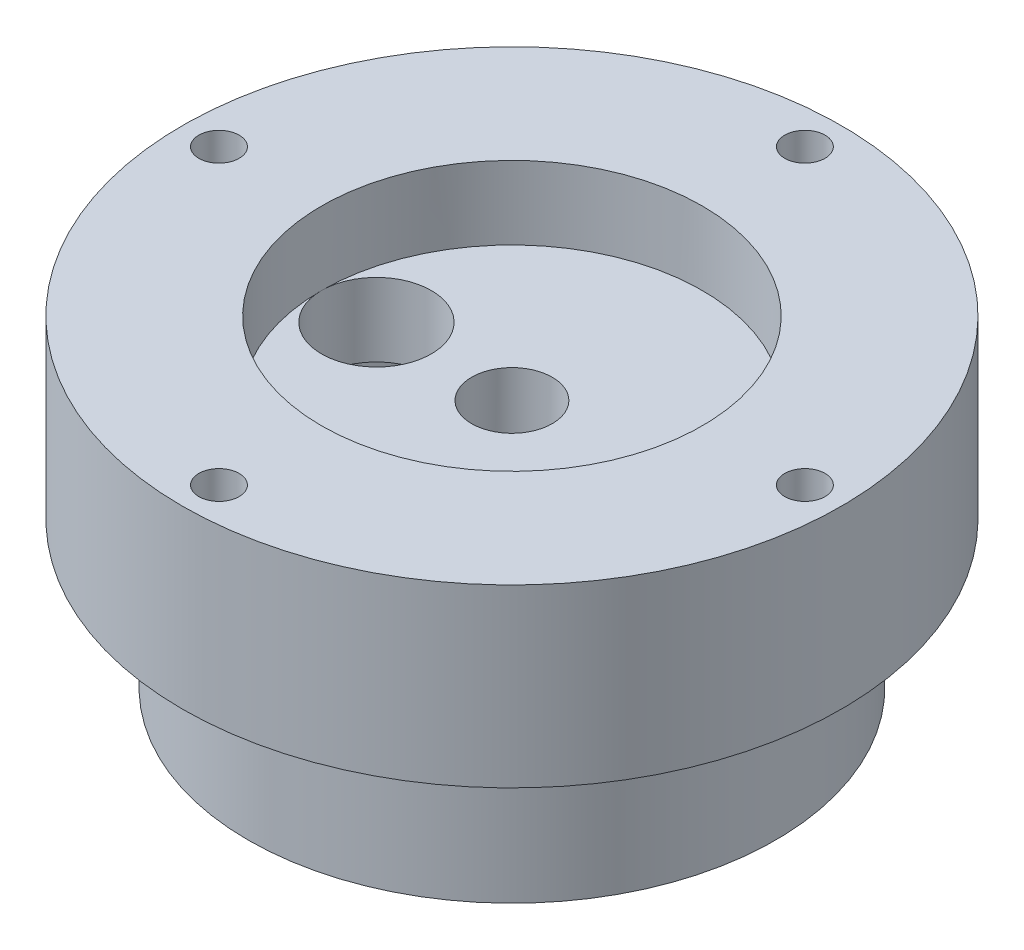
ISO-10303-21;
HEADER;
FILE_DESCRIPTION(('STEP AP214'),'2;1');
FILE_NAME('part.step','',(''),(''),'','','');
FILE_SCHEMA(('AUTOMOTIVE_DESIGN { 1 0 10303 214 1 1 1 1 }'));
ENDSEC;
DATA;
#1=APPLICATION_CONTEXT('core data for automotive mechanical design processes');
#2=APPLICATION_PROTOCOL_DEFINITION('international standard','automotive_design',2000,#1);
#3=PRODUCT_CONTEXT('',#1,'mechanical');
#4=PRODUCT('Part','Part','',(#3));
#5=PRODUCT_RELATED_PRODUCT_CATEGORY('part','',(#4));
#6=PRODUCT_DEFINITION_FORMATION('','',#4);
#7=PRODUCT_DEFINITION_CONTEXT('part definition',#1,'design');
#8=PRODUCT_DEFINITION('design','',#6,#7);
#9=PRODUCT_DEFINITION_SHAPE('','',#8);
#10=(LENGTH_UNIT() NAMED_UNIT(*) SI_UNIT(.MILLI.,.METRE.));
#11=(NAMED_UNIT(*) PLANE_ANGLE_UNIT() SI_UNIT($,.RADIAN.));
#12=(NAMED_UNIT(*) SI_UNIT($,.STERADIAN.) SOLID_ANGLE_UNIT());
#13=UNCERTAINTY_MEASURE_WITH_UNIT(LENGTH_MEASURE(1.E-05),#10,'distance_accuracy_value','');
#14=(GEOMETRIC_REPRESENTATION_CONTEXT(3) GLOBAL_UNCERTAINTY_ASSIGNED_CONTEXT((#13)) GLOBAL_UNIT_ASSIGNED_CONTEXT((#10,
#11,#12)) REPRESENTATION_CONTEXT('',''));
#15=CARTESIAN_POINT('',(0.,0.,0.));
#16=DIRECTION('',(0.,0.,1.));
#17=DIRECTION('',(1.,0.,0.));
#18=AXIS2_PLACEMENT_3D('',#15,#16,#17);
#19=CARTESIAN_POINT('',(0.,2.,0.));
#20=DIRECTION('',(0.,1.,0.));
#21=DIRECTION('',(0.,0.,1.));
#22=AXIS2_PLACEMENT_3D('',#19,#20,#21);
#23=CYLINDRICAL_SURFACE('',#22,22.5);
#24=CARTESIAN_POINT('',(0.,0.,0.));
#25=DIRECTION('',(0.,1.,0.));
#26=DIRECTION('',(0.,0.,1.));
#27=AXIS2_PLACEMENT_3D('',#24,#25,#26);
#28=CIRCLE('',#27,22.5);
#29=CARTESIAN_POINT('',(0.,0.,22.5));
#30=VERTEX_POINT('',#29);
#31=EDGE_CURVE('E11',#30,#30,#28,.T.);
#32=ORIENTED_EDGE('',*,*,#31,.T.);
#33=EDGE_LOOP('',(#32));
#34=FACE_BOUND('',#33,.T.);
#35=CARTESIAN_POINT('',(0.,12.,0.));
#36=DIRECTION('',(0.,1.,0.));
#37=DIRECTION('',(0.,0.,1.));
#38=AXIS2_PLACEMENT_3D('',#35,#36,#37);
#39=CIRCLE('',#38,22.5);
#40=CARTESIAN_POINT('',(0.,12.,22.5));
#41=VERTEX_POINT('',#40);
#42=EDGE_CURVE('E63',#41,#41,#39,.T.);
#43=ORIENTED_EDGE('',*,*,#42,.F.);
#44=EDGE_LOOP('',(#43));
#45=FACE_BOUND('',#44,.T.);
#46=ADVANCED_FACE('F17',(#34,#45),#23,.T.);
#47=CARTESIAN_POINT('',(-22.5,0.,0.));
#48=DIRECTION('',(0.,-1.,0.));
#49=DIRECTION('',(0.,0.,-1.));
#50=AXIS2_PLACEMENT_3D('',#47,#48,#49);
#51=PLANE('',#50);
#52=CARTESIAN_POINT('',(0.,0.,-20.));
#53=DIRECTION('',(0.,-1.,0.));
#54=DIRECTION('',(0.,0.,-1.));
#55=AXIS2_PLACEMENT_3D('',#52,#53,#54);
#56=CIRCLE('',#55,1.375);
#57=CARTESIAN_POINT('',(0.,0.,-21.375));
#58=VERTEX_POINT('',#57);
#59=EDGE_CURVE('E344',#58,#58,#56,.T.);
#60=ORIENTED_EDGE('',*,*,#59,.F.);
#61=EDGE_LOOP('',(#60));
#62=FACE_BOUND('',#61,.T.);
#63=CARTESIAN_POINT('',(20.,0.,0.));
#64=DIRECTION('',(0.,-1.,0.));
#65=DIRECTION('',(0.,0.,-1.));
#66=AXIS2_PLACEMENT_3D('',#63,#64,#65);
#67=CIRCLE('',#66,1.375);
#68=CARTESIAN_POINT('',(20.,0.,-1.375));
#69=VERTEX_POINT('',#68);
#70=EDGE_CURVE('E353',#69,#69,#67,.T.);
#71=ORIENTED_EDGE('',*,*,#70,.F.);
#72=EDGE_LOOP('',(#71));
#73=FACE_BOUND('',#72,.T.);
#74=CARTESIAN_POINT('',(0.,0.,20.));
#75=DIRECTION('',(0.,-1.,0.));
#76=DIRECTION('',(0.,0.,-1.));
#77=AXIS2_PLACEMENT_3D('',#74,#75,#76);
#78=CIRCLE('',#77,1.375);
#79=CARTESIAN_POINT('',(0.,0.,18.625));
#80=VERTEX_POINT('',#79);
#81=EDGE_CURVE('E363',#80,#80,#78,.T.);
#82=ORIENTED_EDGE('',*,*,#81,.F.);
#83=EDGE_LOOP('',(#82));
#84=FACE_BOUND('',#83,.T.);
#85=CARTESIAN_POINT('',(-20.,0.,0.));
#86=DIRECTION('',(0.,-1.,0.));
#87=DIRECTION('',(0.,0.,-1.));
#88=AXIS2_PLACEMENT_3D('',#85,#86,#87);
#89=CIRCLE('',#88,1.375);
#90=CARTESIAN_POINT('',(-20.,0.,-1.375));
#91=VERTEX_POINT('',#90);
#92=EDGE_CURVE('E52',#91,#91,#89,.T.);
#93=ORIENTED_EDGE('',*,*,#92,.F.);
#94=EDGE_LOOP('',(#93));
#95=FACE_BOUND('',#94,.T.);
#96=CARTESIAN_POINT('',(0.,0.,0.));
#97=DIRECTION('',(0.,1.,0.));
#98=DIRECTION('',(0.,0.,1.));
#99=AXIS2_PLACEMENT_3D('',#96,#97,#98);
#100=CIRCLE('',#99,18.);
#101=CARTESIAN_POINT('',(0.,0.,18.));
#102=VERTEX_POINT('',#101);
#103=EDGE_CURVE('E25',#102,#102,#100,.T.);
#104=ORIENTED_EDGE('',*,*,#103,.T.);
#105=EDGE_LOOP('',(#104));
#106=FACE_BOUND('',#105,.T.);
#107=ORIENTED_EDGE('',*,*,#31,.F.);
#108=EDGE_LOOP('',(#107));
#109=FACE_BOUND('',#108,.T.);
#110=ADVANCED_FACE('F90',(#62,#73,#84,#95,#106,#109),#51,.T.);
#111=CARTESIAN_POINT('',(0.,2.,0.));
#112=DIRECTION('',(0.,1.,0.));
#113=DIRECTION('',(0.,0.,1.));
#114=AXIS2_PLACEMENT_3D('',#111,#112,#113);
#115=CYLINDRICAL_SURFACE('',#114,18.);
#116=CARTESIAN_POINT('',(0.,-10.,0.));
#117=DIRECTION('',(0.,1.,0.));
#118=DIRECTION('',(0.,0.,1.));
#119=AXIS2_PLACEMENT_3D('',#116,#117,#118);
#120=CIRCLE('',#119,18.);
#121=CARTESIAN_POINT('',(0.,-10.,18.));
#122=VERTEX_POINT('',#121);
#123=EDGE_CURVE('E82',#122,#122,#120,.T.);
#124=ORIENTED_EDGE('',*,*,#123,.T.);
#125=EDGE_LOOP('',(#124));
#126=FACE_BOUND('',#125,.T.);
#127=ORIENTED_EDGE('',*,*,#103,.F.);
#128=EDGE_LOOP('',(#127));
#129=FACE_BOUND('',#128,.T.);
#130=ADVANCED_FACE('F93',(#126,#129),#115,.T.);
#131=CARTESIAN_POINT('',(-18.,-10.,0.));
#132=DIRECTION('',(0.,-1.,0.));
#133=DIRECTION('',(0.,0.,-1.));
#134=AXIS2_PLACEMENT_3D('',#131,#132,#133);
#135=PLANE('',#134);
#136=CARTESIAN_POINT('',(0.,-10.,0.));
#137=DIRECTION('',(0.,1.,0.));
#138=DIRECTION('',(0.,0.,1.));
#139=AXIS2_PLACEMENT_3D('',#136,#137,#138);
#140=CIRCLE('',#139,13.);
#141=CARTESIAN_POINT('',(0.,-10.,13.));
#142=VERTEX_POINT('',#141);
#143=EDGE_CURVE('E78',#142,#142,#140,.T.);
#144=ORIENTED_EDGE('',*,*,#143,.T.);
#145=EDGE_LOOP('',(#144));
#146=FACE_BOUND('',#145,.T.);
#147=ORIENTED_EDGE('',*,*,#123,.F.);
#148=EDGE_LOOP('',(#147));
#149=FACE_BOUND('',#148,.T.);
#150=ADVANCED_FACE('F95',(#146,#149),#135,.T.);
#151=CARTESIAN_POINT('',(0.,2.,0.));
#152=DIRECTION('',(0.,1.,0.));
#153=DIRECTION('',(0.,0.,1.));
#154=AXIS2_PLACEMENT_3D('',#151,#152,#153);
#155=CYLINDRICAL_SURFACE('',#154,13.);
#156=CARTESIAN_POINT('',(0.,2.,0.));
#157=DIRECTION('',(0.,1.,0.));
#158=DIRECTION('',(0.,0.,1.));
#159=AXIS2_PLACEMENT_3D('',#156,#157,#158);
#160=CIRCLE('',#159,13.);
#161=CARTESIAN_POINT('',(-13.,2.,0.));
#162=VERTEX_POINT('',#161);
#163=EDGE_CURVE('E74',#162,#162,#160,.T.);
#164=ORIENTED_EDGE('',*,*,#163,.T.);
#165=EDGE_LOOP('',(#164));
#166=FACE_BOUND('',#165,.T.);
#167=ORIENTED_EDGE('',*,*,#143,.F.);
#168=EDGE_LOOP('',(#167));
#169=FACE_BOUND('',#168,.T.);
#170=ADVANCED_FACE('F103',(#166,#169),#155,.F.);
#171=CARTESIAN_POINT('',(-13.,2.,0.));
#172=DIRECTION('',(0.,-1.,0.));
#173=DIRECTION('',(0.,0.,-1.));
#174=AXIS2_PLACEMENT_3D('',#171,#172,#173);
#175=PLANE('',#174);
#176=CARTESIAN_POINT('',(0.,2.,0.));
#177=DIRECTION('',(0.,-1.,0.));
#178=DIRECTION('',(0.,0.,-1.));
#179=AXIS2_PLACEMENT_3D('',#176,#177,#178);
#180=CIRCLE('',#179,2.75);
#181=CARTESIAN_POINT('',(0.,2.,-2.75));
#182=VERTEX_POINT('',#181);
#183=EDGE_CURVE('E59',#182,#182,#180,.T.);
#184=ORIENTED_EDGE('',*,*,#183,.F.);
#185=EDGE_LOOP('',(#184));
#186=FACE_BOUND('',#185,.T.);
#187=ORIENTED_EDGE('',*,*,#163,.F.);
#188=CARTESIAN_POINT('',(-9.25,2.,0.));
#189=DIRECTION('',(0.,-1.,0.));
#190=DIRECTION('',(0.,0.,-1.));
#191=AXIS2_PLACEMENT_3D('',#188,#189,#190);
#192=CIRCLE('',#191,3.75);
#193=EDGE_CURVE('E34',#162,#162,#192,.T.);
#194=ORIENTED_EDGE('',*,*,#193,.F.);
#195=EDGE_LOOP('',(#187,#194));
#196=FACE_BOUND('',#195,.T.);
#197=ADVANCED_FACE('F130',(#186,#196),#175,.T.);
#198=CARTESIAN_POINT('',(0.,7.,0.));
#199=DIRECTION('',(0.,1.,0.));
#200=DIRECTION('',(0.,0.,1.));
#201=AXIS2_PLACEMENT_3D('',#198,#199,#200);
#202=PLANE('',#201);
#203=CARTESIAN_POINT('',(0.,7.,0.));
#204=DIRECTION('',(0.,1.,0.));
#205=DIRECTION('',(0.,0.,1.));
#206=AXIS2_PLACEMENT_3D('',#203,#204,#205);
#207=CIRCLE('',#206,2.75);
#208=CARTESIAN_POINT('',(0.,7.,2.75));
#209=VERTEX_POINT('',#208);
#210=EDGE_CURVE('E49',#209,#209,#207,.T.);
#211=ORIENTED_EDGE('',*,*,#210,.F.);
#212=EDGE_LOOP('',(#211));
#213=FACE_BOUND('',#212,.T.);
#214=CARTESIAN_POINT('',(0.,7.,0.));
#215=DIRECTION('',(0.,1.,0.));
#216=DIRECTION('',(0.,0.,1.));
#217=AXIS2_PLACEMENT_3D('',#214,#215,#216);
#218=CIRCLE('',#217,13.);
#219=CARTESIAN_POINT('',(-13.,7.,0.));
#220=VERTEX_POINT('',#219);
#221=EDGE_CURVE('E71',#220,#220,#218,.T.);
#222=ORIENTED_EDGE('',*,*,#221,.T.);
#223=CARTESIAN_POINT('',(-9.25,7.,0.));
#224=DIRECTION('',(0.,1.,0.));
#225=DIRECTION('',(0.,0.,1.));
#226=AXIS2_PLACEMENT_3D('',#223,#224,#225);
#227=CIRCLE('',#226,3.75);
#228=EDGE_CURVE('E39',#220,#220,#227,.T.);
#229=ORIENTED_EDGE('',*,*,#228,.F.);
#230=EDGE_LOOP('',(#222,#229));
#231=FACE_BOUND('',#230,.T.);
#232=ADVANCED_FACE('F126',(#213,#231),#202,.T.);
#233=CARTESIAN_POINT('',(0.,2.,0.));
#234=DIRECTION('',(0.,1.,0.));
#235=DIRECTION('',(0.,0.,1.));
#236=AXIS2_PLACEMENT_3D('',#233,#234,#235);
#237=CYLINDRICAL_SURFACE('',#236,13.);
#238=CARTESIAN_POINT('',(0.,12.,0.));
#239=DIRECTION('',(0.,1.,0.));
#240=DIRECTION('',(0.,0.,1.));
#241=AXIS2_PLACEMENT_3D('',#238,#239,#240);
#242=CIRCLE('',#241,13.);
#243=CARTESIAN_POINT('',(0.,12.,13.));
#244=VERTEX_POINT('',#243);
#245=EDGE_CURVE('E67',#244,#244,#242,.T.);
#246=ORIENTED_EDGE('',*,*,#245,.T.);
#247=EDGE_LOOP('',(#246));
#248=FACE_BOUND('',#247,.T.);
#249=ORIENTED_EDGE('',*,*,#221,.F.);
#250=EDGE_LOOP('',(#249));
#251=FACE_BOUND('',#250,.T.);
#252=ADVANCED_FACE('F119',(#248,#251),#237,.F.);
#253=CARTESIAN_POINT('',(-13.,12.,0.));
#254=DIRECTION('',(0.,1.,0.));
#255=DIRECTION('',(0.,0.,1.));
#256=AXIS2_PLACEMENT_3D('',#253,#254,#255);
#257=PLANE('',#256);
#258=CARTESIAN_POINT('',(0.,12.,-20.));
#259=DIRECTION('',(0.,-1.,0.));
#260=DIRECTION('',(0.,0.,-1.));
#261=AXIS2_PLACEMENT_3D('',#258,#259,#260);
#262=CIRCLE('',#261,1.375);
#263=CARTESIAN_POINT('',(0.,12.,-21.375));
#264=VERTEX_POINT('',#263);
#265=EDGE_CURVE('E348',#264,#264,#262,.T.);
#266=ORIENTED_EDGE('',*,*,#265,.T.);
#267=EDGE_LOOP('',(#266));
#268=FACE_BOUND('',#267,.T.);
#269=CARTESIAN_POINT('',(20.,12.,0.));
#270=DIRECTION('',(0.,-1.,0.));
#271=DIRECTION('',(0.,0.,-1.));
#272=AXIS2_PLACEMENT_3D('',#269,#270,#271);
#273=CIRCLE('',#272,1.375);
#274=CARTESIAN_POINT('',(20.,12.,-1.375));
#275=VERTEX_POINT('',#274);
#276=EDGE_CURVE('E358',#275,#275,#273,.T.);
#277=ORIENTED_EDGE('',*,*,#276,.T.);
#278=EDGE_LOOP('',(#277));
#279=FACE_BOUND('',#278,.T.);
#280=CARTESIAN_POINT('',(0.,12.,20.));
#281=DIRECTION('',(0.,-1.,0.));
#282=DIRECTION('',(0.,0.,-1.));
#283=AXIS2_PLACEMENT_3D('',#280,#281,#282);
#284=CIRCLE('',#283,1.375);
#285=CARTESIAN_POINT('',(0.,12.,18.625));
#286=VERTEX_POINT('',#285);
#287=EDGE_CURVE('E368',#286,#286,#284,.T.);
#288=ORIENTED_EDGE('',*,*,#287,.T.);
#289=EDGE_LOOP('',(#288));
#290=FACE_BOUND('',#289,.T.);
#291=CARTESIAN_POINT('',(-20.,12.,0.));
#292=DIRECTION('',(0.,-1.,0.));
#293=DIRECTION('',(0.,0.,-1.));
#294=AXIS2_PLACEMENT_3D('',#291,#292,#293);
#295=CIRCLE('',#294,1.375);
#296=CARTESIAN_POINT('',(-20.,12.,-1.375));
#297=VERTEX_POINT('',#296);
#298=EDGE_CURVE('E44',#297,#297,#295,.T.);
#299=ORIENTED_EDGE('',*,*,#298,.T.);
#300=EDGE_LOOP('',(#299));
#301=FACE_BOUND('',#300,.T.);
#302=ORIENTED_EDGE('',*,*,#42,.T.);
#303=EDGE_LOOP('',(#302));
#304=FACE_BOUND('',#303,.T.);
#305=ORIENTED_EDGE('',*,*,#245,.F.);
#306=EDGE_LOOP('',(#305));
#307=FACE_BOUND('',#306,.T.);
#308=ADVANCED_FACE('F115',(#268,#279,#290,#301,#304,#307),#257,.T.);
#309=CARTESIAN_POINT('',(0.,-10.,0.));
#310=DIRECTION('',(0.,1.,0.));
#311=DIRECTION('',(0.,0.,1.));
#312=AXIS2_PLACEMENT_3D('',#309,#310,#311);
#313=CYLINDRICAL_SURFACE('',#312,2.75);
#314=ORIENTED_EDGE('',*,*,#183,.T.);
#315=EDGE_LOOP('',(#314));
#316=FACE_BOUND('',#315,.T.);
#317=ORIENTED_EDGE('',*,*,#210,.T.);
#318=EDGE_LOOP('',(#317));
#319=FACE_BOUND('',#318,.T.);
#320=ADVANCED_FACE('F118',(#316,#319),#313,.F.);
#321=CARTESIAN_POINT('',(-9.25,-10.,0.));
#322=DIRECTION('',(0.,1.,0.));
#323=DIRECTION('',(0.,0.,1.));
#324=AXIS2_PLACEMENT_3D('',#321,#322,#323);
#325=CYLINDRICAL_SURFACE('',#324,3.75);
#326=ORIENTED_EDGE('',*,*,#193,.T.);
#327=EDGE_LOOP('',(#326));
#328=FACE_BOUND('',#327,.T.);
#329=ORIENTED_EDGE('',*,*,#228,.T.);
#330=EDGE_LOOP('',(#329));
#331=FACE_BOUND('',#330,.T.);
#332=ADVANCED_FACE('F40',(#328,#331),#325,.F.);
#333=CARTESIAN_POINT('',(-20.,12.,0.));
#334=DIRECTION('',(0.,-1.,0.));
#335=DIRECTION('',(0.,0.,-1.));
#336=AXIS2_PLACEMENT_3D('',#333,#334,#335);
#337=CYLINDRICAL_SURFACE('',#336,1.375);
#338=ORIENTED_EDGE('',*,*,#298,.F.);
#339=EDGE_LOOP('',(#338));
#340=FACE_BOUND('',#339,.T.);
#341=ORIENTED_EDGE('',*,*,#92,.T.);
#342=EDGE_LOOP('',(#341));
#343=FACE_BOUND('',#342,.T.);
#344=ADVANCED_FACE('F200',(#340,#343),#337,.F.);
#345=CARTESIAN_POINT('',(0.,12.,20.));
#346=DIRECTION('',(0.,-1.,0.));
#347=DIRECTION('',(0.,0.,-1.));
#348=AXIS2_PLACEMENT_3D('',#345,#346,#347);
#349=CYLINDRICAL_SURFACE('',#348,1.375);
#350=ORIENTED_EDGE('',*,*,#287,.F.);
#351=EDGE_LOOP('',(#350));
#352=FACE_BOUND('',#351,.T.);
#353=ORIENTED_EDGE('',*,*,#81,.T.);
#354=EDGE_LOOP('',(#353));
#355=FACE_BOUND('',#354,.T.);
#356=ADVANCED_FACE('F210',(#352,#355),#349,.F.);
#357=CARTESIAN_POINT('',(20.,12.,0.));
#358=DIRECTION('',(0.,-1.,0.));
#359=DIRECTION('',(0.,0.,-1.));
#360=AXIS2_PLACEMENT_3D('',#357,#358,#359);
#361=CYLINDRICAL_SURFACE('',#360,1.375);
#362=ORIENTED_EDGE('',*,*,#276,.F.);
#363=EDGE_LOOP('',(#362));
#364=FACE_BOUND('',#363,.T.);
#365=ORIENTED_EDGE('',*,*,#70,.T.);
#366=EDGE_LOOP('',(#365));
#367=FACE_BOUND('',#366,.T.);
#368=ADVANCED_FACE('F221',(#364,#367),#361,.F.);
#369=CARTESIAN_POINT('',(0.,12.,-20.));
#370=DIRECTION('',(0.,-1.,0.));
#371=DIRECTION('',(0.,0.,-1.));
#372=AXIS2_PLACEMENT_3D('',#369,#370,#371);
#373=CYLINDRICAL_SURFACE('',#372,1.375);
#374=ORIENTED_EDGE('',*,*,#265,.F.);
#375=EDGE_LOOP('',(#374));
#376=FACE_BOUND('',#375,.T.);
#377=ORIENTED_EDGE('',*,*,#59,.T.);
#378=EDGE_LOOP('',(#377));
#379=FACE_BOUND('',#378,.T.);
#380=ADVANCED_FACE('F232',(#376,#379),#373,.F.);
#381=CLOSED_SHELL('',(#46,#110,#130,#150,#170,#197,#232,#252,#308,#320,#332,#344,#356,#368,#380));
#382=MANIFOLD_SOLID_BREP('B1',#381);
#383=ADVANCED_BREP_SHAPE_REPRESENTATION('',(#18,#382),#14);
#384=SHAPE_DEFINITION_REPRESENTATION(#9,#383);
ENDSEC;
END-ISO-10303-21;
